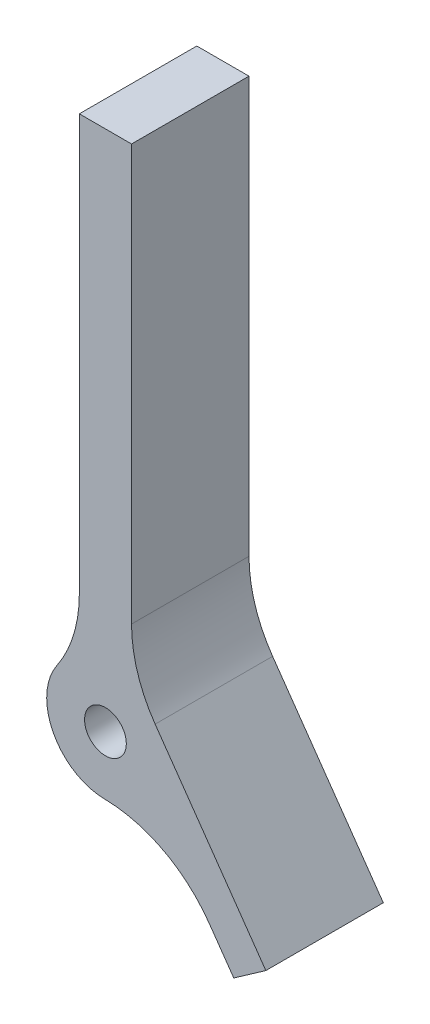
ISO-10303-21;
HEADER;
FILE_DESCRIPTION(('STEP AP214'),'2;1');
FILE_NAME('part.step','',(''),(''),'','','');
FILE_SCHEMA(('AUTOMOTIVE_DESIGN { 1 0 10303 214 1 1 1 1 }'));
ENDSEC;
DATA;
#1=APPLICATION_CONTEXT('core data for automotive mechanical design processes');
#2=APPLICATION_PROTOCOL_DEFINITION('international standard','automotive_design',2000,#1);
#3=PRODUCT_CONTEXT('',#1,'mechanical');
#4=PRODUCT('Part','Part','',(#3));
#5=PRODUCT_RELATED_PRODUCT_CATEGORY('part','',(#4));
#6=PRODUCT_DEFINITION_FORMATION('','',#4);
#7=PRODUCT_DEFINITION_CONTEXT('part definition',#1,'design');
#8=PRODUCT_DEFINITION('design','',#6,#7);
#9=PRODUCT_DEFINITION_SHAPE('','',#8);
#10=(LENGTH_UNIT() NAMED_UNIT(*) SI_UNIT(.MILLI.,.METRE.));
#11=(NAMED_UNIT(*) PLANE_ANGLE_UNIT() SI_UNIT($,.RADIAN.));
#12=(NAMED_UNIT(*) SI_UNIT($,.STERADIAN.) SOLID_ANGLE_UNIT());
#13=UNCERTAINTY_MEASURE_WITH_UNIT(LENGTH_MEASURE(1.E-05),#10,'distance_accuracy_value','');
#14=(GEOMETRIC_REPRESENTATION_CONTEXT(3) GLOBAL_UNCERTAINTY_ASSIGNED_CONTEXT((#13)) GLOBAL_UNIT_ASSIGNED_CONTEXT((#10,
#11,#12)) REPRESENTATION_CONTEXT('',''));
#15=CARTESIAN_POINT('',(0.,0.,0.));
#16=DIRECTION('',(0.,0.,1.));
#17=DIRECTION('',(1.,0.,0.));
#18=AXIS2_PLACEMENT_3D('',#15,#16,#17);
#19=CARTESIAN_POINT('',(-7.49999999999999,20.,9.));
#20=DIRECTION('',(0.,0.,1.));
#21=DIRECTION('',(1.,0.,0.));
#22=AXIS2_PLACEMENT_3D('',#19,#20,#21);
#23=PLANE('',#22);
#24=DIRECTION('',(-0.573576436351047,0.819152044288991,0.));
#25=VECTOR('',#24,1.);
#26=CARTESIAN_POINT('',(-3.81381580069953,22.5810939635797,9.));
#27=LINE('',#26,#25);
#28=CARTESIAN_POINT('',(4.78983074456618,10.2938132992449,9.));
#29=VERTEX_POINT('',#28);
#30=CARTESIAN_POINT('',(-3.6915204428899,22.4064380920901,9.));
#31=VERTEX_POINT('',#30);
#32=EDGE_CURVE('E156',#29,#31,#27,.T.);
#33=ORIENTED_EDGE('',*,*,#32,.T.);
#34=CARTESIAN_POINT('',(4.50000000000001,28.1422024556005,9.));
#35=DIRECTION('',(0.,0.,1.));
#36=DIRECTION('',(1.,0.,0.));
#37=AXIS2_PLACEMENT_3D('',#34,#35,#36);
#38=CIRCLE('',#37,10.);
#39=CARTESIAN_POINT('',(-5.49999999999999,28.1422024556005,9.));
#40=VERTEX_POINT('',#39);
#41=EDGE_CURVE('E11',#31,#40,#38,.F.);
#42=ORIENTED_EDGE('',*,*,#41,.T.);
#43=DIRECTION('',(0.,1.,0.));
#44=VECTOR('',#43,1.);
#45=CARTESIAN_POINT('',(-5.49999999999999,24.0311288741493,9.));
#46=LINE('',#45,#44);
#47=CARTESIAN_POINT('',(-5.49999999999999,60.,9.));
#48=VERTEX_POINT('',#47);
#49=EDGE_CURVE('E119',#40,#48,#46,.T.);
#50=ORIENTED_EDGE('',*,*,#49,.T.);
#51=DIRECTION('',(-1.,0.,0.));
#52=VECTOR('',#51,1.);
#53=CARTESIAN_POINT('',(-5.49999999999999,60.,9.));
#54=LINE('',#53,#52);
#55=CARTESIAN_POINT('',(-9.49999999999999,60.,9.));
#56=VERTEX_POINT('',#55);
#57=EDGE_CURVE('E124',#48,#56,#54,.T.);
#58=ORIENTED_EDGE('',*,*,#57,.T.);
#59=DIRECTION('',(0.,-1.,0.));
#60=VECTOR('',#59,1.);
#61=CARTESIAN_POINT('',(-9.49999999999999,60.,9.));
#62=LINE('',#61,#60);
#63=CARTESIAN_POINT('',(-9.49999999999999,28.1394102980498,9.));
#64=VERTEX_POINT('',#63);
#65=EDGE_CURVE('E144',#56,#64,#62,.T.);
#66=ORIENTED_EDGE('',*,*,#65,.T.);
#67=CARTESIAN_POINT('',(-19.5,28.1394102980498,9.));
#68=DIRECTION('',(0.,0.,1.));
#69=DIRECTION('',(1.,0.,0.));
#70=AXIS2_PLACEMENT_3D('',#67,#68,#69);
#71=CIRCLE('',#70,10.);
#72=CARTESIAN_POINT('',(-11.2241379310345,22.5260238856017,9.));
#73=VERTEX_POINT('',#72);
#74=EDGE_CURVE('E203',#64,#73,#71,.F.);
#75=ORIENTED_EDGE('',*,*,#74,.T.);
#76=CARTESIAN_POINT('',(-7.49999999999999,20.,9.));
#77=DIRECTION('',(0.,0.,1.));
#78=DIRECTION('',(1.,0.,0.));
#79=AXIS2_PLACEMENT_3D('',#76,#77,#78);
#80=CIRCLE('',#79,4.5);
#81=CARTESIAN_POINT('',(-7.56976393176997,15.5005408109614,9.));
#82=VERTEX_POINT('',#81);
#83=EDGE_CURVE('E146',#73,#82,#80,.T.);
#84=ORIENTED_EDGE('',*,*,#83,.T.);
#85=CARTESIAN_POINT('',(-7.72479489125882,5.50174261309781,9.));
#86=DIRECTION('',(0.,0.,1.));
#87=DIRECTION('',(1.,0.,0.));
#88=AXIS2_PLACEMENT_3D('',#85,#86,#87);
#89=CIRCLE('',#88,10.);
#90=CARTESIAN_POINT('',(0.466725551631093,11.2375069766083,9.));
#91=VERTEX_POINT('',#90);
#92=EDGE_CURVE('E198',#82,#91,#89,.F.);
#93=ORIENTED_EDGE('',*,*,#92,.T.);
#94=DIRECTION('',(0.573576436351047,-0.819152044288991,0.));
#95=VECTOR('',#94,1.);
#96=CARTESIAN_POINT('',(2.3323746116992,8.57308399019171,9.));
#97=LINE('',#96,#95);
#98=CARTESIAN_POINT('',(2.3323746116992,8.57308399019171,9.));
#99=VERTEX_POINT('',#98);
#100=EDGE_CURVE('E152',#91,#99,#97,.T.);
#101=ORIENTED_EDGE('',*,*,#100,.T.);
#102=DIRECTION('',(0.819152044288991,0.573576436351047,0.));
#103=VECTOR('',#102,1.);
#104=CARTESIAN_POINT('',(4.78983074456618,10.2938132992449,9.));
#105=LINE('',#104,#103);
#106=EDGE_CURVE('E154',#99,#29,#105,.T.);
#107=ORIENTED_EDGE('',*,*,#106,.T.);
#108=EDGE_LOOP('',(#33,#42,#50,#58,#66,#75,#84,#93,#101,#107));
#109=FACE_BOUND('',#108,.T.);
#110=CARTESIAN_POINT('',(-7.49999999999999,20.,9.));
#111=DIRECTION('',(0.,0.,1.));
#112=DIRECTION('',(1.,0.,0.));
#113=AXIS2_PLACEMENT_3D('',#110,#111,#112);
#114=CIRCLE('',#113,1.6);
#115=CARTESIAN_POINT('',(-5.89999999999999,20.,9.));
#116=VERTEX_POINT('',#115);
#117=EDGE_CURVE('E162',#116,#116,#114,.T.);
#118=ORIENTED_EDGE('',*,*,#117,.F.);
#119=EDGE_LOOP('',(#118));
#120=FACE_BOUND('',#119,.T.);
#121=ADVANCED_FACE('F43',(#109,#120),#23,.T.);
#122=CARTESIAN_POINT('',(-7.49999999999999,20.,0.));
#123=DIRECTION('',(0.,0.,1.));
#124=DIRECTION('',(1.,0.,0.));
#125=AXIS2_PLACEMENT_3D('',#122,#123,#124);
#126=PLANE('',#125);
#127=DIRECTION('',(0.,1.,0.));
#128=VECTOR('',#127,1.);
#129=CARTESIAN_POINT('',(-5.49999999999999,24.0311288741493,0.));
#130=LINE('',#129,#128);
#131=CARTESIAN_POINT('',(-5.49999999999999,28.1422024556005,0.));
#132=VERTEX_POINT('',#131);
#133=CARTESIAN_POINT('',(-5.49999999999999,60.,0.));
#134=VERTEX_POINT('',#133);
#135=EDGE_CURVE('E135',#132,#134,#130,.T.);
#136=ORIENTED_EDGE('',*,*,#135,.F.);
#137=CARTESIAN_POINT('',(4.50000000000001,28.1422024556005,0.));
#138=DIRECTION('',(0.,0.,1.));
#139=DIRECTION('',(1.,0.,0.));
#140=AXIS2_PLACEMENT_3D('',#137,#138,#139);
#141=CIRCLE('',#140,10.);
#142=CARTESIAN_POINT('',(-3.6915204428899,22.4064380920901,0.));
#143=VERTEX_POINT('',#142);
#144=EDGE_CURVE('E51',#132,#143,#141,.T.);
#145=ORIENTED_EDGE('',*,*,#144,.T.);
#146=DIRECTION('',(-0.573576436351047,0.819152044288991,0.));
#147=VECTOR('',#146,1.);
#148=CARTESIAN_POINT('',(-3.81381580069953,22.5810939635797,0.));
#149=LINE('',#148,#147);
#150=CARTESIAN_POINT('',(4.78983074456618,10.2938132992449,0.));
#151=VERTEX_POINT('',#150);
#152=EDGE_CURVE('E130',#151,#143,#149,.T.);
#153=ORIENTED_EDGE('',*,*,#152,.F.);
#154=DIRECTION('',(0.819152044288991,0.573576436351047,0.));
#155=VECTOR('',#154,1.);
#156=CARTESIAN_POINT('',(4.78983074456618,10.2938132992449,0.));
#157=LINE('',#156,#155);
#158=CARTESIAN_POINT('',(2.3323746116992,8.57308399019171,0.));
#159=VERTEX_POINT('',#158);
#160=EDGE_CURVE('E172',#159,#151,#157,.T.);
#161=ORIENTED_EDGE('',*,*,#160,.F.);
#162=DIRECTION('',(0.573576436351047,-0.819152044288991,0.));
#163=VECTOR('',#162,1.);
#164=CARTESIAN_POINT('',(2.3323746116992,8.57308399019171,0.));
#165=LINE('',#164,#163);
#166=CARTESIAN_POINT('',(0.466725551631093,11.2375069766083,0.));
#167=VERTEX_POINT('',#166);
#168=EDGE_CURVE('E170',#167,#159,#165,.T.);
#169=ORIENTED_EDGE('',*,*,#168,.F.);
#170=CARTESIAN_POINT('',(-7.72479489125882,5.50174261309781,0.));
#171=DIRECTION('',(0.,0.,1.));
#172=DIRECTION('',(1.,0.,0.));
#173=AXIS2_PLACEMENT_3D('',#170,#171,#172);
#174=CIRCLE('',#173,10.);
#175=CARTESIAN_POINT('',(-7.56976393176997,15.5005408109614,0.));
#176=VERTEX_POINT('',#175);
#177=EDGE_CURVE('E195',#167,#176,#174,.T.);
#178=ORIENTED_EDGE('',*,*,#177,.T.);
#179=CARTESIAN_POINT('',(-7.49999999999999,20.,0.));
#180=DIRECTION('',(0.,0.,1.));
#181=DIRECTION('',(1.,0.,0.));
#182=AXIS2_PLACEMENT_3D('',#179,#180,#181);
#183=CIRCLE('',#182,4.5);
#184=CARTESIAN_POINT('',(-11.2241379310345,22.5260238856017,0.));
#185=VERTEX_POINT('',#184);
#186=EDGE_CURVE('E167',#185,#176,#183,.T.);
#187=ORIENTED_EDGE('',*,*,#186,.F.);
#188=CARTESIAN_POINT('',(-19.5,28.1394102980498,0.));
#189=DIRECTION('',(0.,0.,1.));
#190=DIRECTION('',(1.,0.,0.));
#191=AXIS2_PLACEMENT_3D('',#188,#189,#190);
#192=CIRCLE('',#191,10.);
#193=CARTESIAN_POINT('',(-9.49999999999999,28.1394102980498,0.));
#194=VERTEX_POINT('',#193);
#195=EDGE_CURVE('E201',#185,#194,#192,.T.);
#196=ORIENTED_EDGE('',*,*,#195,.T.);
#197=DIRECTION('',(0.,-1.,0.));
#198=VECTOR('',#197,1.);
#199=CARTESIAN_POINT('',(-9.49999999999999,60.,0.));
#200=LINE('',#199,#198);
#201=CARTESIAN_POINT('',(-9.49999999999999,60.,0.));
#202=VERTEX_POINT('',#201);
#203=EDGE_CURVE('E164',#202,#194,#200,.T.);
#204=ORIENTED_EDGE('',*,*,#203,.F.);
#205=DIRECTION('',(-1.,0.,0.));
#206=VECTOR('',#205,1.);
#207=CARTESIAN_POINT('',(-5.49999999999999,60.,0.));
#208=LINE('',#207,#206);
#209=EDGE_CURVE('E161',#134,#202,#208,.T.);
#210=ORIENTED_EDGE('',*,*,#209,.F.);
#211=EDGE_LOOP('',(#136,#145,#153,#161,#169,#178,#187,#196,#204,#210));
#212=FACE_BOUND('',#211,.T.);
#213=CARTESIAN_POINT('',(-7.49999999999999,20.,0.));
#214=DIRECTION('',(0.,0.,1.));
#215=DIRECTION('',(1.,0.,0.));
#216=AXIS2_PLACEMENT_3D('',#213,#214,#215);
#217=CIRCLE('',#216,1.6);
#218=CARTESIAN_POINT('',(-5.89999999999999,20.,0.));
#219=VERTEX_POINT('',#218);
#220=EDGE_CURVE('E347',#219,#219,#217,.T.);
#221=ORIENTED_EDGE('',*,*,#220,.T.);
#222=EDGE_LOOP('',(#221));
#223=FACE_BOUND('',#222,.T.);
#224=ADVANCED_FACE('F216',(#212,#223),#126,.F.);
#225=CARTESIAN_POINT('',(-5.49999999999999,24.0311288741493,9.));
#226=DIRECTION('',(-1.,0.,0.));
#227=DIRECTION('',(0.,0.,1.));
#228=AXIS2_PLACEMENT_3D('',#225,#226,#227);
#229=PLANE('',#228);
#230=ORIENTED_EDGE('',*,*,#49,.F.);
#231=DIRECTION('',(0.,0.,-1.));
#232=VECTOR('',#231,1.);
#233=CARTESIAN_POINT('',(-5.49999999999999,28.1422024556005,0.));
#234=LINE('',#233,#232);
#235=EDGE_CURVE('E192',#40,#132,#234,.T.);
#236=ORIENTED_EDGE('',*,*,#235,.T.);
#237=ORIENTED_EDGE('',*,*,#135,.T.);
#238=DIRECTION('',(0.,0.,-1.));
#239=VECTOR('',#238,1.);
#240=CARTESIAN_POINT('',(-5.49999999999999,60.,9.));
#241=LINE('',#240,#239);
#242=EDGE_CURVE('E133',#48,#134,#241,.T.);
#243=ORIENTED_EDGE('',*,*,#242,.F.);
#244=EDGE_LOOP('',(#230,#236,#237,#243));
#245=FACE_BOUND('',#244,.T.);
#246=ADVANCED_FACE('F134',(#245),#229,.F.);
#247=CARTESIAN_POINT('',(-5.49999999999999,60.,9.));
#248=DIRECTION('',(0.,-1.,0.));
#249=DIRECTION('',(0.,0.,-1.));
#250=AXIS2_PLACEMENT_3D('',#247,#248,#249);
#251=PLANE('',#250);
#252=ORIENTED_EDGE('',*,*,#209,.T.);
#253=DIRECTION('',(0.,0.,-1.));
#254=VECTOR('',#253,1.);
#255=CARTESIAN_POINT('',(-9.49999999999999,60.,9.));
#256=LINE('',#255,#254);
#257=EDGE_CURVE('E139',#56,#202,#256,.T.);
#258=ORIENTED_EDGE('',*,*,#257,.F.);
#259=ORIENTED_EDGE('',*,*,#57,.F.);
#260=ORIENTED_EDGE('',*,*,#242,.T.);
#261=EDGE_LOOP('',(#252,#258,#259,#260));
#262=FACE_BOUND('',#261,.T.);
#263=ADVANCED_FACE('F141',(#262),#251,.F.);
#264=CARTESIAN_POINT('',(-9.49999999999999,60.,9.));
#265=DIRECTION('',(1.,0.,0.));
#266=DIRECTION('',(0.,0.,-1.));
#267=AXIS2_PLACEMENT_3D('',#264,#265,#266);
#268=PLANE('',#267);
#269=ORIENTED_EDGE('',*,*,#203,.T.);
#270=DIRECTION('',(0.,0.,1.));
#271=VECTOR('',#270,1.);
#272=CARTESIAN_POINT('',(-9.49999999999999,28.1394102980498,9.));
#273=LINE('',#272,#271);
#274=EDGE_CURVE('E190',#194,#64,#273,.T.);
#275=ORIENTED_EDGE('',*,*,#274,.T.);
#276=ORIENTED_EDGE('',*,*,#65,.F.);
#277=ORIENTED_EDGE('',*,*,#257,.T.);
#278=EDGE_LOOP('',(#269,#275,#276,#277));
#279=FACE_BOUND('',#278,.T.);
#280=ADVANCED_FACE('F219',(#279),#268,.F.);
#281=CARTESIAN_POINT('',(-7.49999999999999,20.,9.));
#282=DIRECTION('',(0.,0.,-1.));
#283=DIRECTION('',(-1.,0.,0.));
#284=AXIS2_PLACEMENT_3D('',#281,#282,#283);
#285=CYLINDRICAL_SURFACE('',#284,4.5);
#286=ORIENTED_EDGE('',*,*,#186,.T.);
#287=DIRECTION('',(0.,0.,-1.));
#288=VECTOR('',#287,1.);
#289=CARTESIAN_POINT('',(-7.56976393176997,15.5005408109614,9.));
#290=LINE('',#289,#288);
#291=EDGE_CURVE('E187',#176,#82,#290,.F.);
#292=ORIENTED_EDGE('',*,*,#291,.T.);
#293=ORIENTED_EDGE('',*,*,#83,.F.);
#294=DIRECTION('',(0.,0.,-1.));
#295=VECTOR('',#294,1.);
#296=CARTESIAN_POINT('',(-11.2241379310345,22.5260238856017,9.));
#297=LINE('',#296,#295);
#298=EDGE_CURVE('E184',#73,#185,#297,.T.);
#299=ORIENTED_EDGE('',*,*,#298,.T.);
#300=EDGE_LOOP('',(#286,#292,#293,#299));
#301=FACE_BOUND('',#300,.T.);
#302=ADVANCED_FACE('F211',(#301),#285,.T.);
#303=CARTESIAN_POINT('',(2.3323746116992,8.57308399019171,9.));
#304=DIRECTION('',(0.819152044288991,0.573576436351047,0.));
#305=DIRECTION('',(-0.573576436351047,0.819152044288991,0.));
#306=AXIS2_PLACEMENT_3D('',#303,#304,#305);
#307=PLANE('',#306);
#308=ORIENTED_EDGE('',*,*,#100,.F.);
#309=DIRECTION('',(0.,0.,1.));
#310=VECTOR('',#309,1.);
#311=CARTESIAN_POINT('',(0.466725551631093,11.2375069766083,0.));
#312=LINE('',#311,#310);
#313=EDGE_CURVE('E138',#91,#167,#312,.F.);
#314=ORIENTED_EDGE('',*,*,#313,.T.);
#315=ORIENTED_EDGE('',*,*,#168,.T.);
#316=DIRECTION('',(0.,0.,-1.));
#317=VECTOR('',#316,1.);
#318=CARTESIAN_POINT('',(2.3323746116992,8.57308399019171,9.));
#319=LINE('',#318,#317);
#320=EDGE_CURVE('E178',#99,#159,#319,.T.);
#321=ORIENTED_EDGE('',*,*,#320,.F.);
#322=EDGE_LOOP('',(#308,#314,#315,#321));
#323=FACE_BOUND('',#322,.T.);
#324=ADVANCED_FACE('F226',(#323),#307,.F.);
#325=CARTESIAN_POINT('',(4.78983074456618,10.2938132992449,9.));
#326=DIRECTION('',(-0.573576436351047,0.819152044288991,0.));
#327=DIRECTION('',(-0.819152044288991,-0.573576436351047,0.));
#328=AXIS2_PLACEMENT_3D('',#325,#326,#327);
#329=PLANE('',#328);
#330=ORIENTED_EDGE('',*,*,#160,.T.);
#331=DIRECTION('',(0.,0.,-1.));
#332=VECTOR('',#331,1.);
#333=CARTESIAN_POINT('',(4.78983074456618,10.2938132992449,9.));
#334=LINE('',#333,#332);
#335=EDGE_CURVE('E159',#29,#151,#334,.T.);
#336=ORIENTED_EDGE('',*,*,#335,.F.);
#337=ORIENTED_EDGE('',*,*,#106,.F.);
#338=ORIENTED_EDGE('',*,*,#320,.T.);
#339=EDGE_LOOP('',(#330,#336,#337,#338));
#340=FACE_BOUND('',#339,.T.);
#341=ADVANCED_FACE('F242',(#340),#329,.F.);
#342=CARTESIAN_POINT('',(-3.81381580069953,22.5810939635797,9.));
#343=DIRECTION('',(-0.819152044288991,-0.573576436351047,0.));
#344=DIRECTION('',(0.573576436351047,-0.819152044288991,0.));
#345=AXIS2_PLACEMENT_3D('',#342,#343,#344);
#346=PLANE('',#345);
#347=ORIENTED_EDGE('',*,*,#152,.T.);
#348=DIRECTION('',(0.,0.,-1.));
#349=VECTOR('',#348,1.);
#350=CARTESIAN_POINT('',(-3.6915204428899,22.4064380920901,9.));
#351=LINE('',#350,#349);
#352=EDGE_CURVE('E58',#143,#31,#351,.F.);
#353=ORIENTED_EDGE('',*,*,#352,.T.);
#354=ORIENTED_EDGE('',*,*,#32,.F.);
#355=ORIENTED_EDGE('',*,*,#335,.T.);
#356=EDGE_LOOP('',(#347,#353,#354,#355));
#357=FACE_BOUND('',#356,.T.);
#358=ADVANCED_FACE('F240',(#357),#346,.F.);
#359=CARTESIAN_POINT('',(-7.49999999999999,20.,9.));
#360=DIRECTION('',(0.,0.,-1.));
#361=DIRECTION('',(-1.,0.,0.));
#362=AXIS2_PLACEMENT_3D('',#359,#360,#361);
#363=CYLINDRICAL_SURFACE('',#362,1.6);
#364=ORIENTED_EDGE('',*,*,#117,.T.);
#365=EDGE_LOOP('',(#364));
#366=FACE_BOUND('',#365,.T.);
#367=ORIENTED_EDGE('',*,*,#220,.F.);
#368=EDGE_LOOP('',(#367));
#369=FACE_BOUND('',#368,.T.);
#370=ADVANCED_FACE('F238',(#366,#369),#363,.F.);
#371=CARTESIAN_POINT('',(-7.72479489125882,5.50174261309781,9.));
#372=DIRECTION('',(0.,0.,-1.));
#373=DIRECTION('',(-1.,0.,0.));
#374=AXIS2_PLACEMENT_3D('',#371,#372,#373);
#375=CYLINDRICAL_SURFACE('',#374,10.);
#376=ORIENTED_EDGE('',*,*,#92,.F.);
#377=ORIENTED_EDGE('',*,*,#291,.F.);
#378=ORIENTED_EDGE('',*,*,#177,.F.);
#379=ORIENTED_EDGE('',*,*,#313,.F.);
#380=EDGE_LOOP('',(#376,#377,#378,#379));
#381=FACE_BOUND('',#380,.T.);
#382=ADVANCED_FACE('F257',(#381),#375,.F.);
#383=CARTESIAN_POINT('',(-19.5,28.1394102980498,9.));
#384=DIRECTION('',(0.,0.,-1.));
#385=DIRECTION('',(-1.,0.,0.));
#386=AXIS2_PLACEMENT_3D('',#383,#384,#385);
#387=CYLINDRICAL_SURFACE('',#386,10.);
#388=ORIENTED_EDGE('',*,*,#74,.F.);
#389=ORIENTED_EDGE('',*,*,#274,.F.);
#390=ORIENTED_EDGE('',*,*,#195,.F.);
#391=ORIENTED_EDGE('',*,*,#298,.F.);
#392=EDGE_LOOP('',(#388,#389,#390,#391));
#393=FACE_BOUND('',#392,.T.);
#394=ADVANCED_FACE('F214',(#393),#387,.F.);
#395=CARTESIAN_POINT('',(4.50000000000001,28.1422024556005,9.));
#396=DIRECTION('',(0.,0.,1.));
#397=DIRECTION('',(1.,0.,0.));
#398=AXIS2_PLACEMENT_3D('',#395,#396,#397);
#399=CYLINDRICAL_SURFACE('',#398,10.);
#400=ORIENTED_EDGE('',*,*,#41,.F.);
#401=ORIENTED_EDGE('',*,*,#352,.F.);
#402=ORIENTED_EDGE('',*,*,#144,.F.);
#403=ORIENTED_EDGE('',*,*,#235,.F.);
#404=EDGE_LOOP('',(#400,#401,#402,#403));
#405=FACE_BOUND('',#404,.T.);
#406=ADVANCED_FACE('F45',(#405),#399,.F.);
#407=CLOSED_SHELL('',(#121,#224,#246,#263,#280,#302,#324,#341,#358,#370,#382,#394,#406));
#408=MANIFOLD_SOLID_BREP('B2',#407);
#409=ADVANCED_BREP_SHAPE_REPRESENTATION('',(#18,#408),#14);
#410=SHAPE_DEFINITION_REPRESENTATION(#9,#409);
ENDSEC;
END-ISO-10303-21;
